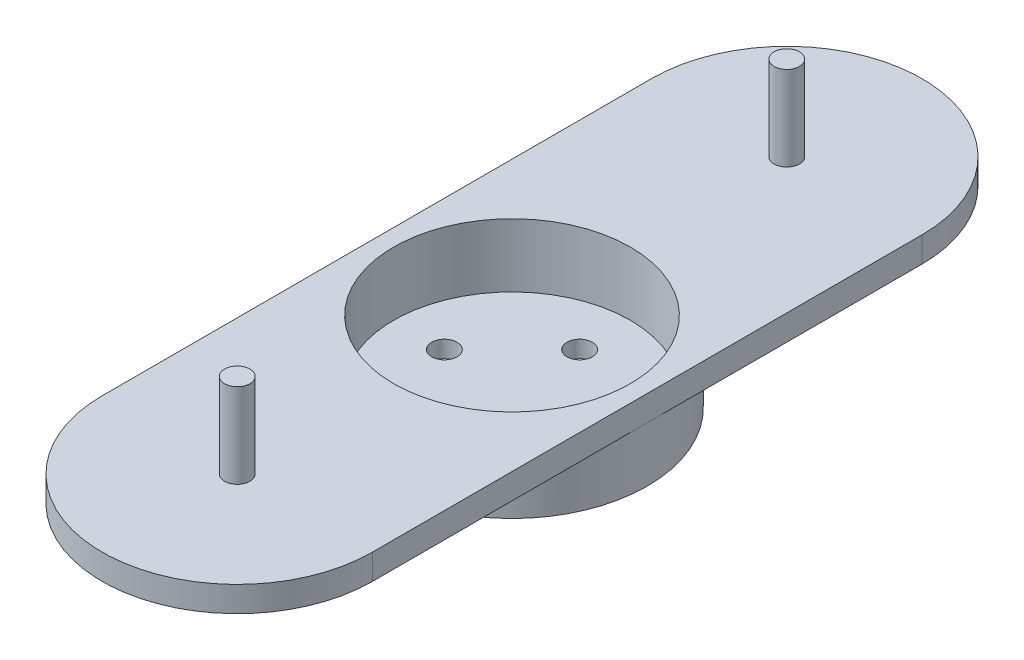
ISO-10303-21;
HEADER;
FILE_DESCRIPTION(('STEP AP214'),'2;1');
FILE_NAME('part.step','',(''),(''),'','','');
FILE_SCHEMA(('AUTOMOTIVE_DESIGN { 1 0 10303 214 1 1 1 1 }'));
ENDSEC;
DATA;
#1=APPLICATION_CONTEXT('core data for automotive mechanical design processes');
#2=APPLICATION_PROTOCOL_DEFINITION('international standard','automotive_design',2000,#1);
#3=PRODUCT_CONTEXT('',#1,'mechanical');
#4=PRODUCT('Part','Part','',(#3));
#5=PRODUCT_RELATED_PRODUCT_CATEGORY('part','',(#4));
#6=PRODUCT_DEFINITION_FORMATION('','',#4);
#7=PRODUCT_DEFINITION_CONTEXT('part definition',#1,'design');
#8=PRODUCT_DEFINITION('design','',#6,#7);
#9=PRODUCT_DEFINITION_SHAPE('','',#8);
#10=(LENGTH_UNIT() NAMED_UNIT(*) SI_UNIT(.MILLI.,.METRE.));
#11=(NAMED_UNIT(*) PLANE_ANGLE_UNIT() SI_UNIT($,.RADIAN.));
#12=(NAMED_UNIT(*) SI_UNIT($,.STERADIAN.) SOLID_ANGLE_UNIT());
#13=UNCERTAINTY_MEASURE_WITH_UNIT(LENGTH_MEASURE(1.E-05),#10,'distance_accuracy_value','');
#14=(GEOMETRIC_REPRESENTATION_CONTEXT(3) GLOBAL_UNCERTAINTY_ASSIGNED_CONTEXT((#13)) GLOBAL_UNIT_ASSIGNED_CONTEXT((#10,
#11,#12)) REPRESENTATION_CONTEXT('',''));
#15=CARTESIAN_POINT('',(0.,0.,0.));
#16=DIRECTION('',(0.,0.,1.));
#17=DIRECTION('',(1.,0.,0.));
#18=AXIS2_PLACEMENT_3D('',#15,#16,#17);
#19=CARTESIAN_POINT('',(0.,6.5,0.));
#20=DIRECTION('',(0.,-1.,0.));
#21=DIRECTION('',(0.,0.,-1.));
#22=AXIS2_PLACEMENT_3D('',#19,#20,#21);
#23=CYLINDRICAL_SURFACE('',#22,16.);
#24=CARTESIAN_POINT('',(0.,6.5,0.));
#25=DIRECTION('',(0.,1.,0.));
#26=DIRECTION('',(0.,0.,1.));
#27=AXIS2_PLACEMENT_3D('',#24,#25,#26);
#28=CIRCLE('',#27,16.);
#29=CARTESIAN_POINT('',(16.,6.5,0.));
#30=VERTEX_POINT('',#29);
#31=CARTESIAN_POINT('',(-16.,6.5,0.));
#32=VERTEX_POINT('',#31);
#33=EDGE_CURVE('E12',#30,#32,#28,.T.);
#34=ORIENTED_EDGE('',*,*,#33,.F.);
#35=EDGE_CURVE('E47',#32,#30,#28,.T.);
#36=ORIENTED_EDGE('',*,*,#35,.F.);
#37=EDGE_LOOP('',(#34,#36));
#38=FACE_BOUND('',#37,.T.);
#39=CARTESIAN_POINT('',(0.,0.,0.));
#40=DIRECTION('',(0.,1.,0.));
#41=DIRECTION('',(0.,0.,1.));
#42=AXIS2_PLACEMENT_3D('',#39,#40,#41);
#43=CIRCLE('',#42,16.);
#44=CARTESIAN_POINT('',(0.,0.,16.));
#45=VERTEX_POINT('',#44);
#46=EDGE_CURVE('E42',#45,#45,#43,.T.);
#47=ORIENTED_EDGE('',*,*,#46,.T.);
#48=EDGE_LOOP('',(#47));
#49=FACE_BOUND('',#48,.T.);
#50=ADVANCED_FACE('F39',(#38,#49),#23,.T.);
#51=CARTESIAN_POINT('',(0.,0.,0.));
#52=DIRECTION('',(0.,1.,0.));
#53=DIRECTION('',(0.,0.,1.));
#54=AXIS2_PLACEMENT_3D('',#51,#52,#53);
#55=PLANE('',#54);
#56=CARTESIAN_POINT('',(8.,0.,0.));
#57=DIRECTION('',(0.,1.,0.));
#58=DIRECTION('',(0.,0.,1.));
#59=AXIS2_PLACEMENT_3D('',#56,#57,#58);
#60=CIRCLE('',#59,1.5);
#61=CARTESIAN_POINT('',(8.,0.,1.5));
#62=VERTEX_POINT('',#61);
#63=EDGE_CURVE('E144',#62,#62,#60,.T.);
#64=ORIENTED_EDGE('',*,*,#63,.T.);
#65=EDGE_LOOP('',(#64));
#66=FACE_BOUND('',#65,.T.);
#67=CARTESIAN_POINT('',(0.,0.,8.));
#68=DIRECTION('',(0.,1.,0.));
#69=DIRECTION('',(0.,0.,1.));
#70=AXIS2_PLACEMENT_3D('',#67,#68,#69);
#71=CIRCLE('',#70,1.5);
#72=CARTESIAN_POINT('',(0.,0.,9.5));
#73=VERTEX_POINT('',#72);
#74=EDGE_CURVE('E160',#73,#73,#71,.T.);
#75=ORIENTED_EDGE('',*,*,#74,.T.);
#76=EDGE_LOOP('',(#75));
#77=FACE_BOUND('',#76,.T.);
#78=CARTESIAN_POINT('',(-8.,0.,0.));
#79=DIRECTION('',(0.,1.,0.));
#80=DIRECTION('',(0.,0.,1.));
#81=AXIS2_PLACEMENT_3D('',#78,#79,#80);
#82=CIRCLE('',#81,1.5);
#83=CARTESIAN_POINT('',(-8.,0.,1.5));
#84=VERTEX_POINT('',#83);
#85=EDGE_CURVE('E154',#84,#84,#82,.T.);
#86=ORIENTED_EDGE('',*,*,#85,.T.);
#87=EDGE_LOOP('',(#86));
#88=FACE_BOUND('',#87,.T.);
#89=CARTESIAN_POINT('',(0.,0.,-8.));
#90=DIRECTION('',(0.,1.,0.));
#91=DIRECTION('',(0.,0.,1.));
#92=AXIS2_PLACEMENT_3D('',#89,#90,#91);
#93=CIRCLE('',#92,1.5);
#94=CARTESIAN_POINT('',(0.,0.,-6.5));
#95=VERTEX_POINT('',#94);
#96=EDGE_CURVE('E148',#95,#95,#93,.T.);
#97=ORIENTED_EDGE('',*,*,#96,.T.);
#98=EDGE_LOOP('',(#97));
#99=FACE_BOUND('',#98,.T.);
#100=ORIENTED_EDGE('',*,*,#46,.F.);
#101=EDGE_LOOP('',(#100));
#102=FACE_BOUND('',#101,.T.);
#103=ADVANCED_FACE('F169',(#66,#77,#88,#99,#102),#55,.F.);
#104=CARTESIAN_POINT('',(0.,6.5,32.5));
#105=DIRECTION('',(0.,1.,0.));
#106=DIRECTION('',(0.,0.,1.));
#107=AXIS2_PLACEMENT_3D('',#104,#105,#106);
#108=PLANE('',#107);
#109=DIRECTION('',(0.,0.,-1.));
#110=VECTOR('',#109,1.);
#111=CARTESIAN_POINT('',(16.,6.5,32.5));
#112=LINE('',#111,#110);
#113=CARTESIAN_POINT('',(16.,6.5,-32.5));
#114=VERTEX_POINT('',#113);
#115=EDGE_CURVE('E122',#30,#114,#112,.T.);
#116=ORIENTED_EDGE('',*,*,#115,.F.);
#117=ORIENTED_EDGE('',*,*,#33,.T.);
#118=DIRECTION('',(0.,0.,1.));
#119=VECTOR('',#118,1.);
#120=CARTESIAN_POINT('',(-16.,6.5,32.5));
#121=LINE('',#120,#119);
#122=CARTESIAN_POINT('',(-16.,6.5,-32.5));
#123=VERTEX_POINT('',#122);
#124=EDGE_CURVE('E101',#123,#32,#121,.T.);
#125=ORIENTED_EDGE('',*,*,#124,.F.);
#126=CARTESIAN_POINT('',(0.,6.5,-32.5));
#127=DIRECTION('',(0.,1.,0.));
#128=DIRECTION('',(0.,0.,1.));
#129=AXIS2_PLACEMENT_3D('',#126,#127,#128);
#130=CIRCLE('',#129,16.);
#131=EDGE_CURVE('E118',#114,#123,#130,.T.);
#132=ORIENTED_EDGE('',*,*,#131,.F.);
#133=EDGE_LOOP('',(#116,#117,#125,#132));
#134=FACE_BOUND('',#133,.T.);
#135=ADVANCED_FACE('F223',(#134),#108,.F.);
#136=CARTESIAN_POINT('',(-16.,6.5,32.5));
#137=VERTEX_POINT('',#136);
#138=EDGE_CURVE('E117',#32,#137,#121,.T.);
#139=ORIENTED_EDGE('',*,*,#138,.F.);
#140=ORIENTED_EDGE('',*,*,#35,.T.);
#141=CARTESIAN_POINT('',(16.,6.5,32.5));
#142=VERTEX_POINT('',#141);
#143=EDGE_CURVE('E120',#142,#30,#112,.T.);
#144=ORIENTED_EDGE('',*,*,#143,.F.);
#145=CARTESIAN_POINT('',(0.,6.5,32.5));
#146=DIRECTION('',(0.,1.,0.));
#147=DIRECTION('',(0.,0.,1.));
#148=AXIS2_PLACEMENT_3D('',#145,#146,#147);
#149=CIRCLE('',#148,16.);
#150=EDGE_CURVE('E105',#137,#142,#149,.T.);
#151=ORIENTED_EDGE('',*,*,#150,.F.);
#152=EDGE_LOOP('',(#139,#140,#144,#151));
#153=FACE_BOUND('',#152,.T.);
#154=ADVANCED_FACE('F230',(#153),#108,.F.);
#155=CARTESIAN_POINT('',(0.,9.5,32.5));
#156=DIRECTION('',(0.,-1.,0.));
#157=DIRECTION('',(0.,0.,-1.));
#158=AXIS2_PLACEMENT_3D('',#155,#156,#157);
#159=CYLINDRICAL_SURFACE('',#158,16.);
#160=ORIENTED_EDGE('',*,*,#150,.T.);
#161=DIRECTION('',(0.,-1.,0.));
#162=VECTOR('',#161,1.);
#163=CARTESIAN_POINT('',(16.,9.5,32.5));
#164=LINE('',#163,#162);
#165=CARTESIAN_POINT('',(16.,9.5,32.5));
#166=VERTEX_POINT('',#165);
#167=EDGE_CURVE('E85',#166,#142,#164,.T.);
#168=ORIENTED_EDGE('',*,*,#167,.F.);
#169=CARTESIAN_POINT('',(0.,9.5,32.5));
#170=DIRECTION('',(0.,1.,0.));
#171=DIRECTION('',(0.,0.,1.));
#172=AXIS2_PLACEMENT_3D('',#169,#170,#171);
#173=CIRCLE('',#172,16.);
#174=CARTESIAN_POINT('',(-16.,9.5,32.5));
#175=VERTEX_POINT('',#174);
#176=EDGE_CURVE('E92',#175,#166,#173,.T.);
#177=ORIENTED_EDGE('',*,*,#176,.F.);
#178=DIRECTION('',(0.,-1.,0.));
#179=VECTOR('',#178,1.);
#180=CARTESIAN_POINT('',(-16.,9.5,32.5));
#181=LINE('',#180,#179);
#182=EDGE_CURVE('E113',#175,#137,#181,.T.);
#183=ORIENTED_EDGE('',*,*,#182,.T.);
#184=EDGE_LOOP('',(#160,#168,#177,#183));
#185=FACE_BOUND('',#184,.T.);
#186=ADVANCED_FACE('F103',(#185),#159,.T.);
#187=CARTESIAN_POINT('',(16.,9.5,32.5));
#188=DIRECTION('',(-1.,0.,0.));
#189=DIRECTION('',(0.,0.,1.));
#190=AXIS2_PLACEMENT_3D('',#187,#188,#189);
#191=PLANE('',#190);
#192=ORIENTED_EDGE('',*,*,#143,.T.);
#193=ORIENTED_EDGE('',*,*,#115,.T.);
#194=DIRECTION('',(0.,-1.,0.));
#195=VECTOR('',#194,1.);
#196=CARTESIAN_POINT('',(16.,9.5,-32.5));
#197=LINE('',#196,#195);
#198=CARTESIAN_POINT('',(16.,9.5,-32.5));
#199=VERTEX_POINT('',#198);
#200=EDGE_CURVE('E88',#199,#114,#197,.T.);
#201=ORIENTED_EDGE('',*,*,#200,.F.);
#202=DIRECTION('',(0.,0.,-1.));
#203=VECTOR('',#202,1.);
#204=CARTESIAN_POINT('',(16.,9.5,32.5));
#205=LINE('',#204,#203);
#206=EDGE_CURVE('E80',#166,#199,#205,.T.);
#207=ORIENTED_EDGE('',*,*,#206,.F.);
#208=ORIENTED_EDGE('',*,*,#167,.T.);
#209=EDGE_LOOP('',(#192,#193,#201,#207,#208));
#210=FACE_BOUND('',#209,.T.);
#211=ADVANCED_FACE('F83',(#210),#191,.F.);
#212=CARTESIAN_POINT('',(0.,9.5,-32.5));
#213=DIRECTION('',(0.,-1.,0.));
#214=DIRECTION('',(0.,0.,-1.));
#215=AXIS2_PLACEMENT_3D('',#212,#213,#214);
#216=CYLINDRICAL_SURFACE('',#215,16.);
#217=ORIENTED_EDGE('',*,*,#131,.T.);
#218=DIRECTION('',(0.,-1.,0.));
#219=VECTOR('',#218,1.);
#220=CARTESIAN_POINT('',(-16.,9.5,-32.5));
#221=LINE('',#220,#219);
#222=CARTESIAN_POINT('',(-16.,9.5,-32.5));
#223=VERTEX_POINT('',#222);
#224=EDGE_CURVE('E108',#223,#123,#221,.T.);
#225=ORIENTED_EDGE('',*,*,#224,.F.);
#226=CARTESIAN_POINT('',(0.,9.5,-32.5));
#227=DIRECTION('',(0.,1.,0.));
#228=DIRECTION('',(0.,0.,1.));
#229=AXIS2_PLACEMENT_3D('',#226,#227,#228);
#230=CIRCLE('',#229,16.);
#231=EDGE_CURVE('E91',#199,#223,#230,.T.);
#232=ORIENTED_EDGE('',*,*,#231,.F.);
#233=ORIENTED_EDGE('',*,*,#200,.T.);
#234=EDGE_LOOP('',(#217,#225,#232,#233));
#235=FACE_BOUND('',#234,.T.);
#236=ADVANCED_FACE('F238',(#235),#216,.T.);
#237=CARTESIAN_POINT('',(-16.,9.5,32.5));
#238=DIRECTION('',(1.,0.,0.));
#239=DIRECTION('',(0.,0.,-1.));
#240=AXIS2_PLACEMENT_3D('',#237,#238,#239);
#241=PLANE('',#240);
#242=ORIENTED_EDGE('',*,*,#124,.T.);
#243=ORIENTED_EDGE('',*,*,#138,.T.);
#244=ORIENTED_EDGE('',*,*,#182,.F.);
#245=DIRECTION('',(0.,0.,1.));
#246=VECTOR('',#245,1.);
#247=CARTESIAN_POINT('',(-16.,9.5,32.5));
#248=LINE('',#247,#246);
#249=EDGE_CURVE('E97',#223,#175,#248,.T.);
#250=ORIENTED_EDGE('',*,*,#249,.F.);
#251=ORIENTED_EDGE('',*,*,#224,.T.);
#252=EDGE_LOOP('',(#242,#243,#244,#250,#251));
#253=FACE_BOUND('',#252,.T.);
#254=ADVANCED_FACE('F202',(#253),#241,.F.);
#255=CARTESIAN_POINT('',(0.,9.5,32.5));
#256=DIRECTION('',(0.,1.,0.));
#257=DIRECTION('',(0.,0.,1.));
#258=AXIS2_PLACEMENT_3D('',#255,#256,#257);
#259=PLANE('',#258);
#260=CARTESIAN_POINT('',(0.,9.5,0.));
#261=DIRECTION('',(0.,1.,0.));
#262=DIRECTION('',(0.,0.,1.));
#263=AXIS2_PLACEMENT_3D('',#260,#261,#262);
#264=CIRCLE('',#263,14.);
#265=CARTESIAN_POINT('',(0.,9.5,14.));
#266=VERTEX_POINT('',#265);
#267=EDGE_CURVE('E141',#266,#266,#264,.T.);
#268=ORIENTED_EDGE('',*,*,#267,.F.);
#269=EDGE_LOOP('',(#268));
#270=FACE_BOUND('',#269,.T.);
#271=CARTESIAN_POINT('',(0.,9.5,32.5));
#272=DIRECTION('',(0.,1.,0.));
#273=DIRECTION('',(0.,0.,1.));
#274=AXIS2_PLACEMENT_3D('',#271,#272,#273);
#275=CIRCLE('',#274,1.5);
#276=CARTESIAN_POINT('',(0.,9.5,34.));
#277=VERTEX_POINT('',#276);
#278=EDGE_CURVE('E133',#277,#277,#275,.T.);
#279=ORIENTED_EDGE('',*,*,#278,.F.);
#280=EDGE_LOOP('',(#279));
#281=FACE_BOUND('',#280,.T.);
#282=CARTESIAN_POINT('',(0.,9.5,-32.5));
#283=DIRECTION('',(0.,1.,0.));
#284=DIRECTION('',(0.,0.,1.));
#285=AXIS2_PLACEMENT_3D('',#282,#283,#284);
#286=CIRCLE('',#285,1.5);
#287=CARTESIAN_POINT('',(0.,9.5,-31.));
#288=VERTEX_POINT('',#287);
#289=EDGE_CURVE('E127',#288,#288,#286,.T.);
#290=ORIENTED_EDGE('',*,*,#289,.F.);
#291=EDGE_LOOP('',(#290));
#292=FACE_BOUND('',#291,.T.);
#293=ORIENTED_EDGE('',*,*,#176,.T.);
#294=ORIENTED_EDGE('',*,*,#206,.T.);
#295=ORIENTED_EDGE('',*,*,#231,.T.);
#296=ORIENTED_EDGE('',*,*,#249,.T.);
#297=EDGE_LOOP('',(#293,#294,#295,#296));
#298=FACE_BOUND('',#297,.T.);
#299=ADVANCED_FACE('F95',(#270,#281,#292,#298),#259,.T.);
#300=CARTESIAN_POINT('',(0.,19.5,-32.5));
#301=DIRECTION('',(0.,-1.,0.));
#302=DIRECTION('',(0.,0.,-1.));
#303=AXIS2_PLACEMENT_3D('',#300,#301,#302);
#304=CYLINDRICAL_SURFACE('',#303,1.5);
#305=CARTESIAN_POINT('',(0.,19.5,-32.5));
#306=DIRECTION('',(0.,1.,0.));
#307=DIRECTION('',(0.,0.,1.));
#308=AXIS2_PLACEMENT_3D('',#305,#306,#307);
#309=CIRCLE('',#308,1.5);
#310=CARTESIAN_POINT('',(0.,19.5,-31.));
#311=VERTEX_POINT('',#310);
#312=EDGE_CURVE('E124',#311,#311,#309,.T.);
#313=ORIENTED_EDGE('',*,*,#312,.F.);
#314=EDGE_LOOP('',(#313));
#315=FACE_BOUND('',#314,.T.);
#316=ORIENTED_EDGE('',*,*,#289,.T.);
#317=EDGE_LOOP('',(#316));
#318=FACE_BOUND('',#317,.T.);
#319=ADVANCED_FACE('F201',(#315,#318),#304,.T.);
#320=CARTESIAN_POINT('',(0.,19.5,-32.5));
#321=DIRECTION('',(0.,1.,0.));
#322=DIRECTION('',(0.,0.,1.));
#323=AXIS2_PLACEMENT_3D('',#320,#321,#322);
#324=PLANE('',#323);
#325=ORIENTED_EDGE('',*,*,#312,.T.);
#326=EDGE_LOOP('',(#325));
#327=FACE_BOUND('',#326,.T.);
#328=ADVANCED_FACE('F209',(#327),#324,.T.);
#329=CARTESIAN_POINT('',(0.,19.5,32.5));
#330=DIRECTION('',(0.,-1.,0.));
#331=DIRECTION('',(0.,0.,-1.));
#332=AXIS2_PLACEMENT_3D('',#329,#330,#331);
#333=CYLINDRICAL_SURFACE('',#332,1.5);
#334=CARTESIAN_POINT('',(0.,19.5,32.5));
#335=DIRECTION('',(0.,1.,0.));
#336=DIRECTION('',(0.,0.,1.));
#337=AXIS2_PLACEMENT_3D('',#334,#335,#336);
#338=CIRCLE('',#337,1.5);
#339=CARTESIAN_POINT('',(0.,19.5,34.));
#340=VERTEX_POINT('',#339);
#341=EDGE_CURVE('E130',#340,#340,#338,.T.);
#342=ORIENTED_EDGE('',*,*,#341,.F.);
#343=EDGE_LOOP('',(#342));
#344=FACE_BOUND('',#343,.T.);
#345=ORIENTED_EDGE('',*,*,#278,.T.);
#346=EDGE_LOOP('',(#345));
#347=FACE_BOUND('',#346,.T.);
#348=ADVANCED_FACE('F215',(#344,#347),#333,.T.);
#349=CARTESIAN_POINT('',(0.,19.5,32.5));
#350=DIRECTION('',(0.,1.,0.));
#351=DIRECTION('',(0.,0.,1.));
#352=AXIS2_PLACEMENT_3D('',#349,#350,#351);
#353=PLANE('',#352);
#354=ORIENTED_EDGE('',*,*,#341,.T.);
#355=EDGE_LOOP('',(#354));
#356=FACE_BOUND('',#355,.T.);
#357=ADVANCED_FACE('F195',(#356),#353,.T.);
#358=CARTESIAN_POINT('',(0.,-39.5979797464467,0.));
#359=DIRECTION('',(0.,1.,0.));
#360=DIRECTION('',(0.,0.,1.));
#361=AXIS2_PLACEMENT_3D('',#358,#359,#360);
#362=CYLINDRICAL_SURFACE('',#361,14.);
#363=CARTESIAN_POINT('',(0.,2.,0.));
#364=DIRECTION('',(0.,1.,0.));
#365=DIRECTION('',(0.,0.,1.));
#366=AXIS2_PLACEMENT_3D('',#363,#364,#365);
#367=CIRCLE('',#366,14.);
#368=CARTESIAN_POINT('',(0.,2.,14.));
#369=VERTEX_POINT('',#368);
#370=EDGE_CURVE('E136',#369,#369,#367,.F.);
#371=ORIENTED_EDGE('',*,*,#370,.T.);
#372=EDGE_LOOP('',(#371));
#373=FACE_BOUND('',#372,.T.);
#374=ORIENTED_EDGE('',*,*,#267,.T.);
#375=EDGE_LOOP('',(#374));
#376=FACE_BOUND('',#375,.T.);
#377=ADVANCED_FACE('F183',(#373,#376),#362,.F.);
#378=CARTESIAN_POINT('',(0.,2.,0.));
#379=DIRECTION('',(0.,1.,0.));
#380=DIRECTION('',(0.,0.,1.));
#381=AXIS2_PLACEMENT_3D('',#378,#379,#380);
#382=PLANE('',#381);
#383=CARTESIAN_POINT('',(8.,2.,0.));
#384=DIRECTION('',(0.,1.,0.));
#385=DIRECTION('',(0.,0.,1.));
#386=AXIS2_PLACEMENT_3D('',#383,#384,#385);
#387=CIRCLE('',#386,1.5);
#388=CARTESIAN_POINT('',(8.,2.,1.5));
#389=VERTEX_POINT('',#388);
#390=EDGE_CURVE('E163',#389,#389,#387,.T.);
#391=ORIENTED_EDGE('',*,*,#390,.F.);
#392=EDGE_LOOP('',(#391));
#393=FACE_BOUND('',#392,.T.);
#394=CARTESIAN_POINT('',(0.,2.,8.));
#395=DIRECTION('',(0.,1.,0.));
#396=DIRECTION('',(0.,0.,1.));
#397=AXIS2_PLACEMENT_3D('',#394,#395,#396);
#398=CIRCLE('',#397,1.5);
#399=CARTESIAN_POINT('',(0.,2.,9.5));
#400=VERTEX_POINT('',#399);
#401=EDGE_CURVE('E157',#400,#400,#398,.T.);
#402=ORIENTED_EDGE('',*,*,#401,.F.);
#403=EDGE_LOOP('',(#402));
#404=FACE_BOUND('',#403,.T.);
#405=CARTESIAN_POINT('',(-8.,2.,0.));
#406=DIRECTION('',(0.,1.,0.));
#407=DIRECTION('',(0.,0.,1.));
#408=AXIS2_PLACEMENT_3D('',#405,#406,#407);
#409=CIRCLE('',#408,1.5);
#410=CARTESIAN_POINT('',(-8.,2.,1.5));
#411=VERTEX_POINT('',#410);
#412=EDGE_CURVE('E151',#411,#411,#409,.T.);
#413=ORIENTED_EDGE('',*,*,#412,.F.);
#414=EDGE_LOOP('',(#413));
#415=FACE_BOUND('',#414,.T.);
#416=CARTESIAN_POINT('',(0.,2.,-8.));
#417=DIRECTION('',(0.,1.,0.));
#418=DIRECTION('',(0.,0.,1.));
#419=AXIS2_PLACEMENT_3D('',#416,#417,#418);
#420=CIRCLE('',#419,1.5);
#421=CARTESIAN_POINT('',(0.,2.,-6.5));
#422=VERTEX_POINT('',#421);
#423=EDGE_CURVE('E145',#422,#422,#420,.T.);
#424=ORIENTED_EDGE('',*,*,#423,.F.);
#425=EDGE_LOOP('',(#424));
#426=FACE_BOUND('',#425,.T.);
#427=ORIENTED_EDGE('',*,*,#370,.F.);
#428=EDGE_LOOP('',(#427));
#429=FACE_BOUND('',#428,.T.);
#430=ADVANCED_FACE('F179',(#393,#404,#415,#426,#429),#382,.T.);
#431=CARTESIAN_POINT('',(0.,0.,-8.));
#432=DIRECTION('',(0.,1.,0.));
#433=DIRECTION('',(0.,0.,1.));
#434=AXIS2_PLACEMENT_3D('',#431,#432,#433);
#435=CYLINDRICAL_SURFACE('',#434,1.5);
#436=ORIENTED_EDGE('',*,*,#96,.F.);
#437=EDGE_LOOP('',(#436));
#438=FACE_BOUND('',#437,.T.);
#439=ORIENTED_EDGE('',*,*,#423,.T.);
#440=EDGE_LOOP('',(#439));
#441=FACE_BOUND('',#440,.T.);
#442=ADVANCED_FACE('F182',(#438,#441),#435,.F.);
#443=CARTESIAN_POINT('',(-8.,0.,0.));
#444=DIRECTION('',(0.,1.,0.));
#445=DIRECTION('',(0.,0.,1.));
#446=AXIS2_PLACEMENT_3D('',#443,#444,#445);
#447=CYLINDRICAL_SURFACE('',#446,1.5);
#448=ORIENTED_EDGE('',*,*,#85,.F.);
#449=EDGE_LOOP('',(#448));
#450=FACE_BOUND('',#449,.T.);
#451=ORIENTED_EDGE('',*,*,#412,.T.);
#452=EDGE_LOOP('',(#451));
#453=FACE_BOUND('',#452,.T.);
#454=ADVANCED_FACE('F334',(#450,#453),#447,.F.);
#455=CARTESIAN_POINT('',(0.,0.,8.));
#456=DIRECTION('',(0.,1.,0.));
#457=DIRECTION('',(0.,0.,1.));
#458=AXIS2_PLACEMENT_3D('',#455,#456,#457);
#459=CYLINDRICAL_SURFACE('',#458,1.5);
#460=ORIENTED_EDGE('',*,*,#74,.F.);
#461=EDGE_LOOP('',(#460));
#462=FACE_BOUND('',#461,.T.);
#463=ORIENTED_EDGE('',*,*,#401,.T.);
#464=EDGE_LOOP('',(#463));
#465=FACE_BOUND('',#464,.T.);
#466=ADVANCED_FACE('F175',(#462,#465),#459,.F.);
#467=CARTESIAN_POINT('',(8.,0.,0.));
#468=DIRECTION('',(0.,1.,0.));
#469=DIRECTION('',(0.,0.,1.));
#470=AXIS2_PLACEMENT_3D('',#467,#468,#469);
#471=CYLINDRICAL_SURFACE('',#470,1.5);
#472=ORIENTED_EDGE('',*,*,#63,.F.);
#473=EDGE_LOOP('',(#472));
#474=FACE_BOUND('',#473,.T.);
#475=ORIENTED_EDGE('',*,*,#390,.T.);
#476=EDGE_LOOP('',(#475));
#477=FACE_BOUND('',#476,.T.);
#478=ADVANCED_FACE('F172',(#474,#477),#471,.F.);
#479=CLOSED_SHELL('',(#50,#103,#135,#154,#186,#211,#236,#254,#299,#319,#328,#348,#357,#377,#430,
#442,#454,#466,#478));
#480=MANIFOLD_SOLID_BREP('B2',#479);
#481=ADVANCED_BREP_SHAPE_REPRESENTATION('',(#18,#480),#14);
#482=SHAPE_DEFINITION_REPRESENTATION(#9,#481);
ENDSEC;
END-ISO-10303-21;
